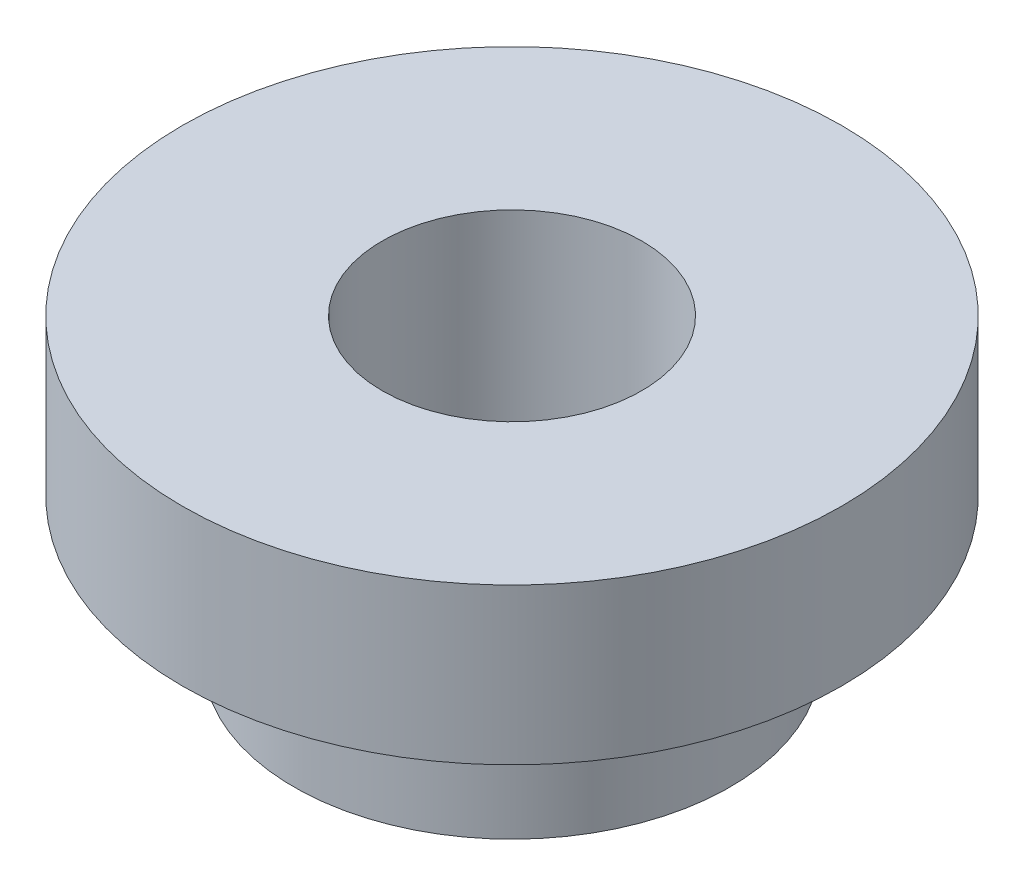
ISO-10303-21;
HEADER;
FILE_DESCRIPTION(('STEP AP214'),'2;1');
FILE_NAME('part.step','',(''),(''),'','','');
FILE_SCHEMA(('AUTOMOTIVE_DESIGN { 1 0 10303 214 1 1 1 1 }'));
ENDSEC;
DATA;
#1=APPLICATION_CONTEXT('core data for automotive mechanical design processes');
#2=APPLICATION_PROTOCOL_DEFINITION('international standard','automotive_design',2000,#1);
#3=PRODUCT_CONTEXT('',#1,'mechanical');
#4=PRODUCT('Part','Part','',(#3));
#5=PRODUCT_RELATED_PRODUCT_CATEGORY('part','',(#4));
#6=PRODUCT_DEFINITION_FORMATION('','',#4);
#7=PRODUCT_DEFINITION_CONTEXT('part definition',#1,'design');
#8=PRODUCT_DEFINITION('design','',#6,#7);
#9=PRODUCT_DEFINITION_SHAPE('','',#8);
#10=(LENGTH_UNIT() NAMED_UNIT(*) SI_UNIT(.MILLI.,.METRE.));
#11=(NAMED_UNIT(*) PLANE_ANGLE_UNIT() SI_UNIT($,.RADIAN.));
#12=(NAMED_UNIT(*) SI_UNIT($,.STERADIAN.) SOLID_ANGLE_UNIT());
#13=UNCERTAINTY_MEASURE_WITH_UNIT(LENGTH_MEASURE(1.E-05),#10,'distance_accuracy_value','');
#14=(GEOMETRIC_REPRESENTATION_CONTEXT(3) GLOBAL_UNCERTAINTY_ASSIGNED_CONTEXT((#13)) GLOBAL_UNIT_ASSIGNED_CONTEXT((#10,
#11,#12)) REPRESENTATION_CONTEXT('',''));
#15=CARTESIAN_POINT('',(0.,0.,0.));
#16=DIRECTION('',(0.,0.,1.));
#17=DIRECTION('',(1.,0.,0.));
#18=AXIS2_PLACEMENT_3D('',#15,#16,#17);
#19=CARTESIAN_POINT('',(483.010652388511,372.886343001901,-533.5375));
#20=DIRECTION('',(0.,-1.,0.));
#21=DIRECTION('',(0.,0.,-1.));
#22=AXIS2_PLACEMENT_3D('',#19,#20,#21);
#23=CYLINDRICAL_SURFACE('',#22,2.1);
#24=CARTESIAN_POINT('',(483.010652388511,372.886343001901,-533.5375));
#25=DIRECTION('',(0.,-1.,0.));
#26=DIRECTION('',(0.,0.,-1.));
#27=AXIS2_PLACEMENT_3D('',#24,#25,#26);
#28=CIRCLE('',#27,2.1);
#29=CARTESIAN_POINT('',(483.010652388511,372.886343001901,-535.6375));
#30=VERTEX_POINT('',#29);
#31=EDGE_CURVE('E41',#30,#30,#28,.F.);
#32=ORIENTED_EDGE('',*,*,#31,.F.);
#33=EDGE_LOOP('',(#32));
#34=FACE_BOUND('',#33,.T.);
#35=CARTESIAN_POINT('',(483.010652388511,371.506343001901,-533.5375));
#36=DIRECTION('',(0.,-1.,0.));
#37=DIRECTION('',(0.,0.,-1.));
#38=AXIS2_PLACEMENT_3D('',#35,#36,#37);
#39=CIRCLE('',#38,2.1);
#40=CARTESIAN_POINT('',(483.010652388511,371.506343001901,-535.6375));
#41=VERTEX_POINT('',#40);
#42=EDGE_CURVE('E17',#41,#41,#39,.T.);
#43=ORIENTED_EDGE('',*,*,#42,.F.);
#44=EDGE_LOOP('',(#43));
#45=FACE_BOUND('',#44,.T.);
#46=ADVANCED_FACE('F14',(#34,#45),#23,.T.);
#47=CARTESIAN_POINT('',(476.510652388512,371.506343001901,-528.8375));
#48=DIRECTION('',(0.,-1.,0.));
#49=DIRECTION('',(0.,0.,-1.));
#50=AXIS2_PLACEMENT_3D('',#47,#48,#49);
#51=PLANE('',#50);
#52=ORIENTED_EDGE('',*,*,#42,.T.);
#53=EDGE_LOOP('',(#52));
#54=FACE_BOUND('',#53,.T.);
#55=CARTESIAN_POINT('',(483.010652388511,371.506343001897,-533.5375));
#56=DIRECTION('',(0.,-1.,0.));
#57=DIRECTION('',(0.,0.,-1.));
#58=AXIS2_PLACEMENT_3D('',#55,#56,#57);
#59=CIRCLE('',#58,1.70000000000536);
#60=CARTESIAN_POINT('',(483.010652388511,371.506343001897,-535.237500000005));
#61=VERTEX_POINT('',#60);
#62=EDGE_CURVE('E38',#61,#61,#59,.F.);
#63=ORIENTED_EDGE('',*,*,#62,.T.);
#64=EDGE_LOOP('',(#63));
#65=FACE_BOUND('',#64,.T.);
#66=ADVANCED_FACE('F50',(#54,#65),#51,.T.);
#67=CARTESIAN_POINT('',(476.510652388512,372.886343001901,-528.8375));
#68=DIRECTION('',(0.,-1.,0.));
#69=DIRECTION('',(0.,0.,-1.));
#70=AXIS2_PLACEMENT_3D('',#67,#68,#69);
#71=PLANE('',#70);
#72=ORIENTED_EDGE('',*,*,#31,.T.);
#73=EDGE_LOOP('',(#72));
#74=FACE_BOUND('',#73,.T.);
#75=CARTESIAN_POINT('',(483.010652388511,372.886343001901,-533.5375));
#76=DIRECTION('',(0.,-1.,0.));
#77=DIRECTION('',(0.,0.,-1.));
#78=AXIS2_PLACEMENT_3D('',#75,#76,#77);
#79=CIRCLE('',#78,3.175);
#80=CARTESIAN_POINT('',(483.010652388511,372.886343001901,-536.7125));
#81=VERTEX_POINT('',#80);
#82=EDGE_CURVE('E35',#81,#81,#79,.F.);
#83=ORIENTED_EDGE('',*,*,#82,.F.);
#84=EDGE_LOOP('',(#83));
#85=FACE_BOUND('',#84,.T.);
#86=ADVANCED_FACE('F58',(#74,#85),#71,.T.);
#87=CARTESIAN_POINT('',(483.010652388511,371.506343001897,-533.5375));
#88=DIRECTION('',(0.,-1.,0.));
#89=DIRECTION('',(0.,0.,-1.));
#90=AXIS2_PLACEMENT_3D('',#87,#88,#89);
#91=CONICAL_SURFACE('',#90,1.70000000000536,1.0471975511755);
#92=ORIENTED_EDGE('',*,*,#62,.F.);
#93=EDGE_LOOP('',(#92));
#94=FACE_BOUND('',#93,.T.);
#95=CARTESIAN_POINT('',(483.010652388511,371.766150623036,-533.5375));
#96=DIRECTION('',(0.,-1.,0.));
#97=DIRECTION('',(0.,0.,-1.));
#98=AXIS2_PLACEMENT_3D('',#95,#96,#97);
#99=CIRCLE('',#98,1.25);
#100=CARTESIAN_POINT('',(483.010652388511,371.766150623036,-534.7875));
#101=VERTEX_POINT('',#100);
#102=EDGE_CURVE('E31',#101,#101,#99,.F.);
#103=ORIENTED_EDGE('',*,*,#102,.T.);
#104=EDGE_LOOP('',(#103));
#105=FACE_BOUND('',#104,.T.);
#106=ADVANCED_FACE('F72',(#94,#105),#91,.F.);
#107=CARTESIAN_POINT('',(483.010652388511,374.386343001901,-533.5375));
#108=DIRECTION('',(0.,-1.,0.));
#109=DIRECTION('',(0.,0.,-1.));
#110=AXIS2_PLACEMENT_3D('',#107,#108,#109);
#111=CYLINDRICAL_SURFACE('',#110,3.175);
#112=CARTESIAN_POINT('',(483.010652388511,374.386343001901,-533.5375));
#113=DIRECTION('',(0.,-1.,0.));
#114=DIRECTION('',(0.,0.,-1.));
#115=AXIS2_PLACEMENT_3D('',#112,#113,#114);
#116=CIRCLE('',#115,3.175);
#117=CARTESIAN_POINT('',(483.010652388511,374.386343001901,-536.7125));
#118=VERTEX_POINT('',#117);
#119=EDGE_CURVE('E22',#118,#118,#116,.T.);
#120=ORIENTED_EDGE('',*,*,#119,.T.);
#121=EDGE_LOOP('',(#120));
#122=FACE_BOUND('',#121,.T.);
#123=ORIENTED_EDGE('',*,*,#82,.T.);
#124=EDGE_LOOP('',(#123));
#125=FACE_BOUND('',#124,.T.);
#126=ADVANCED_FACE('F66',(#122,#125),#111,.T.);
#127=CARTESIAN_POINT('',(483.010652388511,371.506343001901,-533.5375));
#128=DIRECTION('',(0.,-1.,0.));
#129=DIRECTION('',(0.,0.,-1.));
#130=AXIS2_PLACEMENT_3D('',#127,#128,#129);
#131=CYLINDRICAL_SURFACE('',#130,1.25);
#132=CARTESIAN_POINT('',(483.010652388511,374.386343001901,-533.5375));
#133=DIRECTION('',(0.,-1.,0.));
#134=DIRECTION('',(0.,0.,-1.));
#135=AXIS2_PLACEMENT_3D('',#132,#133,#134);
#136=CIRCLE('',#135,1.25);
#137=CARTESIAN_POINT('',(483.010652388511,374.386343001901,-534.7875));
#138=VERTEX_POINT('',#137);
#139=EDGE_CURVE('E10',#138,#138,#136,.F.);
#140=ORIENTED_EDGE('',*,*,#139,.T.);
#141=EDGE_LOOP('',(#140));
#142=FACE_BOUND('',#141,.T.);
#143=ORIENTED_EDGE('',*,*,#102,.F.);
#144=EDGE_LOOP('',(#143));
#145=FACE_BOUND('',#144,.T.);
#146=ADVANCED_FACE('F61',(#142,#145),#131,.F.);
#147=CARTESIAN_POINT('',(476.510652388512,374.386343001901,-528.8375));
#148=DIRECTION('',(0.,-1.,0.));
#149=DIRECTION('',(0.,0.,-1.));
#150=AXIS2_PLACEMENT_3D('',#147,#148,#149);
#151=PLANE('',#150);
#152=ORIENTED_EDGE('',*,*,#139,.F.);
#153=EDGE_LOOP('',(#152));
#154=FACE_BOUND('',#153,.T.);
#155=ORIENTED_EDGE('',*,*,#119,.F.);
#156=EDGE_LOOP('',(#155));
#157=FACE_BOUND('',#156,.T.);
#158=ADVANCED_FACE('F59',(#154,#157),#151,.F.);
#159=CLOSED_SHELL('',(#46,#66,#86,#106,#126,#146,#158));
#160=MANIFOLD_SOLID_BREP('B1',#159);
#161=ADVANCED_BREP_SHAPE_REPRESENTATION('',(#18,#160),#14);
#162=SHAPE_DEFINITION_REPRESENTATION(#9,#161);
ENDSEC;
END-ISO-10303-21;
